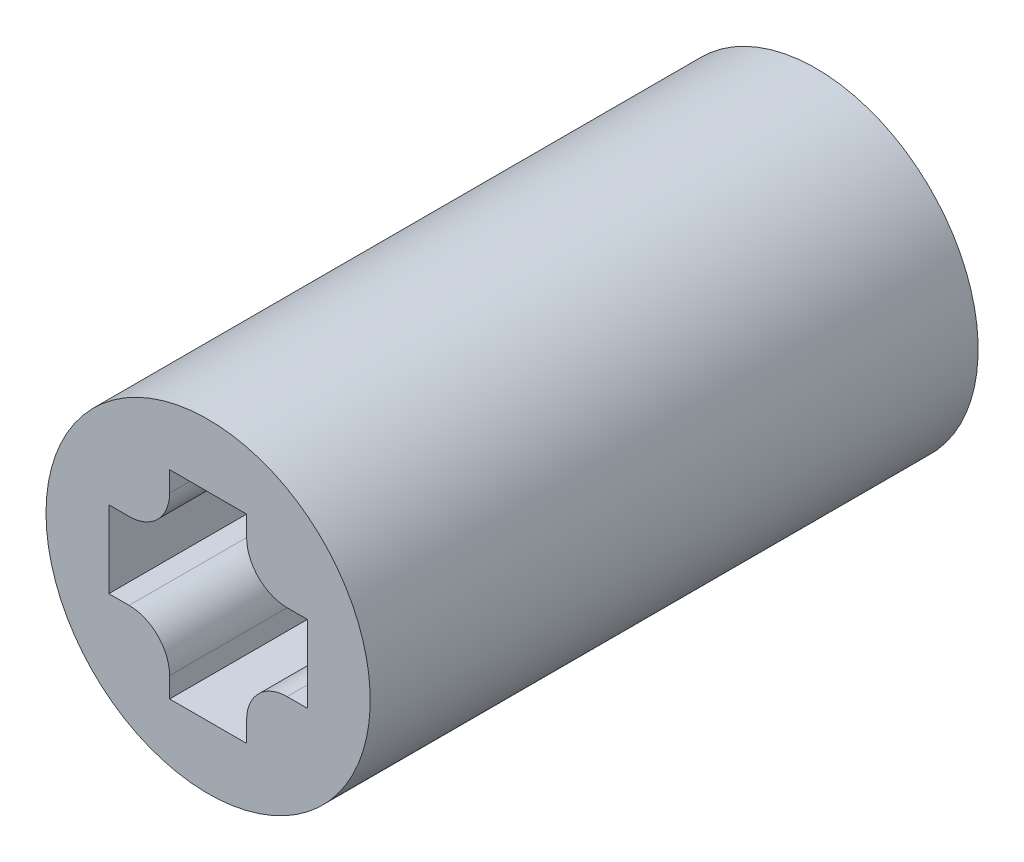
ISO-10303-21;
HEADER;
FILE_DESCRIPTION(('STEP AP214'),'2;1');
FILE_NAME('part.step','',(''),(''),'','','');
FILE_SCHEMA(('AUTOMOTIVE_DESIGN { 1 0 10303 214 1 1 1 1 }'));
ENDSEC;
DATA;
#1=APPLICATION_CONTEXT('core data for automotive mechanical design processes');
#2=APPLICATION_PROTOCOL_DEFINITION('international standard','automotive_design',2000,#1);
#3=PRODUCT_CONTEXT('',#1,'mechanical');
#4=PRODUCT('Part','Part','',(#3));
#5=PRODUCT_RELATED_PRODUCT_CATEGORY('part','',(#4));
#6=PRODUCT_DEFINITION_FORMATION('','',#4);
#7=PRODUCT_DEFINITION_CONTEXT('part definition',#1,'design');
#8=PRODUCT_DEFINITION('design','',#6,#7);
#9=PRODUCT_DEFINITION_SHAPE('','',#8);
#10=(LENGTH_UNIT() NAMED_UNIT(*) SI_UNIT(.MILLI.,.METRE.));
#11=(NAMED_UNIT(*) PLANE_ANGLE_UNIT() SI_UNIT($,.RADIAN.));
#12=(NAMED_UNIT(*) SI_UNIT($,.STERADIAN.) SOLID_ANGLE_UNIT());
#13=UNCERTAINTY_MEASURE_WITH_UNIT(LENGTH_MEASURE(1.E-05),#10,'distance_accuracy_value','');
#14=(GEOMETRIC_REPRESENTATION_CONTEXT(3) GLOBAL_UNCERTAINTY_ASSIGNED_CONTEXT((#13)) GLOBAL_UNIT_ASSIGNED_CONTEXT((#10,
#11,#12)) REPRESENTATION_CONTEXT('',''));
#15=CARTESIAN_POINT('',(0.,0.,0.));
#16=DIRECTION('',(0.,0.,1.));
#17=DIRECTION('',(1.,0.,0.));
#18=AXIS2_PLACEMENT_3D('',#15,#16,#17);
#19=CARTESIAN_POINT('',(0.,0.,0.));
#20=DIRECTION('',(0.,0.,1.));
#21=DIRECTION('',(1.,0.,0.));
#22=AXIS2_PLACEMENT_3D('',#19,#20,#21);
#23=PLANE('',#22);
#24=DIRECTION('',(1.,0.,0.));
#25=VECTOR('',#24,1.);
#26=CARTESIAN_POINT('',(2.,3.,0.));
#27=LINE('',#26,#25);
#28=CARTESIAN_POINT('',(-1.1,3.,0.));
#29=VERTEX_POINT('',#28);
#30=CARTESIAN_POINT('',(1.1,3.,0.));
#31=VERTEX_POINT('',#30);
#32=EDGE_CURVE('E316',#29,#31,#27,.T.);
#33=ORIENTED_EDGE('',*,*,#32,.F.);
#34=CARTESIAN_POINT('',(-1.1,2.1,0.));
#35=DIRECTION('',(0.,0.,1.));
#36=DIRECTION('',(1.,0.,0.));
#37=AXIS2_PLACEMENT_3D('',#34,#35,#36);
#38=CIRCLE('',#37,0.9);
#39=CARTESIAN_POINT('',(-2.,2.1,0.));
#40=VERTEX_POINT('',#39);
#41=EDGE_CURVE('E12',#29,#40,#38,.T.);
#42=ORIENTED_EDGE('',*,*,#41,.T.);
#43=DIRECTION('',(0.,1.,0.));
#44=VECTOR('',#43,1.);
#45=CARTESIAN_POINT('',(-2.,3.,0.));
#46=LINE('',#45,#44);
#47=CARTESIAN_POINT('',(-2.,-2.1,0.));
#48=VERTEX_POINT('',#47);
#49=EDGE_CURVE('E285',#48,#40,#46,.T.);
#50=ORIENTED_EDGE('',*,*,#49,.F.);
#51=CARTESIAN_POINT('',(-1.1,-2.1,0.));
#52=DIRECTION('',(0.,0.,1.));
#53=DIRECTION('',(1.,0.,0.));
#54=AXIS2_PLACEMENT_3D('',#51,#52,#53);
#55=CIRCLE('',#54,0.9);
#56=CARTESIAN_POINT('',(-1.1,-3.,0.));
#57=VERTEX_POINT('',#56);
#58=EDGE_CURVE('E385',#48,#57,#55,.T.);
#59=ORIENTED_EDGE('',*,*,#58,.T.);
#60=DIRECTION('',(-1.,0.,0.));
#61=VECTOR('',#60,1.);
#62=CARTESIAN_POINT('',(2.,-3.,0.));
#63=LINE('',#62,#61);
#64=CARTESIAN_POINT('',(1.1,-3.,0.));
#65=VERTEX_POINT('',#64);
#66=EDGE_CURVE('E304',#65,#57,#63,.T.);
#67=ORIENTED_EDGE('',*,*,#66,.F.);
#68=CARTESIAN_POINT('',(1.1,-2.1,0.));
#69=DIRECTION('',(0.,0.,1.));
#70=DIRECTION('',(1.,0.,0.));
#71=AXIS2_PLACEMENT_3D('',#68,#69,#70);
#72=CIRCLE('',#71,0.9);
#73=CARTESIAN_POINT('',(2.,-2.1,0.));
#74=VERTEX_POINT('',#73);
#75=EDGE_CURVE('E383',#65,#74,#72,.T.);
#76=ORIENTED_EDGE('',*,*,#75,.T.);
#77=DIRECTION('',(0.,-1.,0.));
#78=VECTOR('',#77,1.);
#79=CARTESIAN_POINT('',(2.,3.,0.));
#80=LINE('',#79,#78);
#81=CARTESIAN_POINT('',(2.,2.1,0.));
#82=VERTEX_POINT('',#81);
#83=EDGE_CURVE('E318',#82,#74,#80,.T.);
#84=ORIENTED_EDGE('',*,*,#83,.F.);
#85=CARTESIAN_POINT('',(1.1,2.1,0.));
#86=DIRECTION('',(0.,0.,1.));
#87=DIRECTION('',(1.,0.,0.));
#88=AXIS2_PLACEMENT_3D('',#85,#86,#87);
#89=CIRCLE('',#88,0.9);
#90=EDGE_CURVE('E47',#82,#31,#89,.T.);
#91=ORIENTED_EDGE('',*,*,#90,.T.);
#92=EDGE_LOOP('',(#33,#42,#50,#59,#67,#76,#84,#91));
#93=FACE_BOUND('',#92,.T.);
#94=CARTESIAN_POINT('',(0.,0.,0.));
#95=DIRECTION('',(0.,0.,-1.));
#96=DIRECTION('',(-1.,0.,0.));
#97=AXIS2_PLACEMENT_3D('',#94,#95,#96);
#98=CIRCLE('',#97,4.);
#99=CARTESIAN_POINT('',(-4.,0.,0.));
#100=VERTEX_POINT('',#99);
#101=EDGE_CURVE('E730',#100,#100,#98,.T.);
#102=ORIENTED_EDGE('',*,*,#101,.T.);
#103=EDGE_LOOP('',(#102));
#104=FACE_BOUND('',#103,.T.);
#105=ADVANCED_FACE('F39',(#93,#104),#23,.F.);
#106=CARTESIAN_POINT('',(0.,0.,15.));
#107=DIRECTION('',(0.,0.,-1.));
#108=DIRECTION('',(-1.,0.,0.));
#109=AXIS2_PLACEMENT_3D('',#106,#107,#108);
#110=CYLINDRICAL_SURFACE('',#109,4.);
#111=ORIENTED_EDGE('',*,*,#101,.F.);
#112=EDGE_LOOP('',(#111));
#113=FACE_BOUND('',#112,.T.);
#114=CARTESIAN_POINT('',(0.,0.,15.));
#115=DIRECTION('',(0.,0.,-1.));
#116=DIRECTION('',(-1.,0.,0.));
#117=AXIS2_PLACEMENT_3D('',#114,#115,#116);
#118=CIRCLE('',#117,4.);
#119=CARTESIAN_POINT('',(-4.,0.,15.));
#120=VERTEX_POINT('',#119);
#121=EDGE_CURVE('E255',#120,#120,#118,.T.);
#122=ORIENTED_EDGE('',*,*,#121,.T.);
#123=EDGE_LOOP('',(#122));
#124=FACE_BOUND('',#123,.T.);
#125=ADVANCED_FACE('F430',(#113,#124),#110,.T.);
#126=CARTESIAN_POINT('',(0.,0.,15.));
#127=DIRECTION('',(0.,0.,1.));
#128=DIRECTION('',(1.,0.,0.));
#129=AXIS2_PLACEMENT_3D('',#126,#127,#128);
#130=PLANE('',#129);
#131=ORIENTED_EDGE('',*,*,#121,.F.);
#132=EDGE_LOOP('',(#131));
#133=FACE_BOUND('',#132,.T.);
#134=DIRECTION('',(0.,-1.,0.));
#135=VECTOR('',#134,1.);
#136=CARTESIAN_POINT('',(-0.949999999999999,-0.95,15.));
#137=LINE('',#136,#135);
#138=CARTESIAN_POINT('',(-0.949999999999999,-1.95,15.));
#139=VERTEX_POINT('',#138);
#140=CARTESIAN_POINT('',(-0.949999999999999,-2.45,15.));
#141=VERTEX_POINT('',#140);
#142=EDGE_CURVE('E276',#139,#141,#137,.T.);
#143=ORIENTED_EDGE('',*,*,#142,.F.);
#144=CARTESIAN_POINT('',(-1.95,-1.95,15.));
#145=DIRECTION('',(0.,0.,1.));
#146=DIRECTION('',(1.,0.,0.));
#147=AXIS2_PLACEMENT_3D('',#144,#145,#146);
#148=CIRCLE('',#147,1.);
#149=CARTESIAN_POINT('',(-1.95,-0.95,15.));
#150=VERTEX_POINT('',#149);
#151=EDGE_CURVE('E331',#139,#150,#148,.T.);
#152=ORIENTED_EDGE('',*,*,#151,.T.);
#153=DIRECTION('',(1.,0.,0.));
#154=VECTOR('',#153,1.);
#155=CARTESIAN_POINT('',(-2.45,-0.95,15.));
#156=LINE('',#155,#154);
#157=CARTESIAN_POINT('',(-2.45,-0.95,15.));
#158=VERTEX_POINT('',#157);
#159=EDGE_CURVE('E273',#158,#150,#156,.T.);
#160=ORIENTED_EDGE('',*,*,#159,.F.);
#161=DIRECTION('',(0.,-1.,0.));
#162=VECTOR('',#161,1.);
#163=CARTESIAN_POINT('',(-2.45,0.95,15.));
#164=LINE('',#163,#162);
#165=CARTESIAN_POINT('',(-2.45,0.95,15.));
#166=VERTEX_POINT('',#165);
#167=EDGE_CURVE('E270',#166,#158,#164,.T.);
#168=ORIENTED_EDGE('',*,*,#167,.F.);
#169=DIRECTION('',(-1.,0.,0.));
#170=VECTOR('',#169,1.);
#171=CARTESIAN_POINT('',(-2.45,0.95,15.));
#172=LINE('',#171,#170);
#173=CARTESIAN_POINT('',(-1.95,0.95,15.));
#174=VERTEX_POINT('',#173);
#175=EDGE_CURVE('E268',#174,#166,#172,.T.);
#176=ORIENTED_EDGE('',*,*,#175,.F.);
#177=CARTESIAN_POINT('',(-1.95,1.95,15.));
#178=DIRECTION('',(0.,0.,1.));
#179=DIRECTION('',(1.,0.,0.));
#180=AXIS2_PLACEMENT_3D('',#177,#178,#179);
#181=CIRCLE('',#180,1.);
#182=CARTESIAN_POINT('',(-0.949999999999999,1.95,15.));
#183=VERTEX_POINT('',#182);
#184=EDGE_CURVE('E327',#174,#183,#181,.T.);
#185=ORIENTED_EDGE('',*,*,#184,.T.);
#186=DIRECTION('',(0.,-1.,0.));
#187=VECTOR('',#186,1.);
#188=CARTESIAN_POINT('',(-0.949999999999999,2.45,15.));
#189=LINE('',#188,#187);
#190=CARTESIAN_POINT('',(-0.949999999999999,2.45,15.));
#191=VERTEX_POINT('',#190);
#192=EDGE_CURVE('E265',#191,#183,#189,.T.);
#193=ORIENTED_EDGE('',*,*,#192,.F.);
#194=DIRECTION('',(-1.,0.,0.));
#195=VECTOR('',#194,1.);
#196=CARTESIAN_POINT('',(-0.949999999999999,2.45,15.));
#197=LINE('',#196,#195);
#198=CARTESIAN_POINT('',(0.950000000000001,2.45,15.));
#199=VERTEX_POINT('',#198);
#200=EDGE_CURVE('E262',#199,#191,#197,.T.);
#201=ORIENTED_EDGE('',*,*,#200,.F.);
#202=DIRECTION('',(0.,1.,0.));
#203=VECTOR('',#202,1.);
#204=CARTESIAN_POINT('',(0.950000000000001,2.45,15.));
#205=LINE('',#204,#203);
#206=CARTESIAN_POINT('',(0.950000000000001,1.95,15.));
#207=VERTEX_POINT('',#206);
#208=EDGE_CURVE('E260',#207,#199,#205,.T.);
#209=ORIENTED_EDGE('',*,*,#208,.F.);
#210=CARTESIAN_POINT('',(1.95,1.95,15.));
#211=DIRECTION('',(0.,0.,1.));
#212=DIRECTION('',(1.,0.,0.));
#213=AXIS2_PLACEMENT_3D('',#210,#211,#212);
#214=CIRCLE('',#213,1.);
#215=CARTESIAN_POINT('',(1.95,0.95,15.));
#216=VERTEX_POINT('',#215);
#217=EDGE_CURVE('E325',#207,#216,#214,.T.);
#218=ORIENTED_EDGE('',*,*,#217,.T.);
#219=DIRECTION('',(-1.,0.,0.));
#220=VECTOR('',#219,1.);
#221=CARTESIAN_POINT('',(0.950000000000001,0.95,15.));
#222=LINE('',#221,#220);
#223=CARTESIAN_POINT('',(2.45,0.95,15.));
#224=VERTEX_POINT('',#223);
#225=EDGE_CURVE('E257',#224,#216,#222,.T.);
#226=ORIENTED_EDGE('',*,*,#225,.F.);
#227=DIRECTION('',(0.,1.,0.));
#228=VECTOR('',#227,1.);
#229=CARTESIAN_POINT('',(2.45,0.95,15.));
#230=LINE('',#229,#228);
#231=CARTESIAN_POINT('',(2.45,-0.95,15.));
#232=VERTEX_POINT('',#231);
#233=EDGE_CURVE('E254',#232,#224,#230,.T.);
#234=ORIENTED_EDGE('',*,*,#233,.F.);
#235=DIRECTION('',(1.,0.,0.));
#236=VECTOR('',#235,1.);
#237=CARTESIAN_POINT('',(0.950000000000001,-0.95,15.));
#238=LINE('',#237,#236);
#239=CARTESIAN_POINT('',(1.95,-0.95,15.));
#240=VERTEX_POINT('',#239);
#241=EDGE_CURVE('E217',#240,#232,#238,.T.);
#242=ORIENTED_EDGE('',*,*,#241,.F.);
#243=CARTESIAN_POINT('',(1.95,-1.95,15.));
#244=DIRECTION('',(0.,0.,1.));
#245=DIRECTION('',(1.,0.,0.));
#246=AXIS2_PLACEMENT_3D('',#243,#244,#245);
#247=CIRCLE('',#246,1.);
#248=CARTESIAN_POINT('',(0.950000000000001,-1.95,15.));
#249=VERTEX_POINT('',#248);
#250=EDGE_CURVE('E329',#240,#249,#247,.T.);
#251=ORIENTED_EDGE('',*,*,#250,.T.);
#252=DIRECTION('',(0.,1.,0.));
#253=VECTOR('',#252,1.);
#254=CARTESIAN_POINT('',(0.950000000000001,-0.95,15.));
#255=LINE('',#254,#253);
#256=CARTESIAN_POINT('',(0.950000000000002,-2.45,15.));
#257=VERTEX_POINT('',#256);
#258=EDGE_CURVE('E211',#257,#249,#255,.T.);
#259=ORIENTED_EDGE('',*,*,#258,.F.);
#260=DIRECTION('',(1.,0.,0.));
#261=VECTOR('',#260,1.);
#262=CARTESIAN_POINT('',(-0.949999999999999,-2.45,15.));
#263=LINE('',#262,#261);
#264=EDGE_CURVE('E278',#141,#257,#263,.T.);
#265=ORIENTED_EDGE('',*,*,#264,.F.);
#266=EDGE_LOOP('',(#143,#152,#160,#168,#176,#185,#193,#201,#209,#218,#226,#234,#242,#251,#259,#265));
#267=FACE_BOUND('',#266,.T.);
#268=ADVANCED_FACE('F435',(#133,#267),#130,.T.);
#269=CARTESIAN_POINT('',(0.950000000000001,-0.95,8.00000000000001));
#270=DIRECTION('',(0.,-1.,0.));
#271=DIRECTION('',(0.,0.,-1.));
#272=AXIS2_PLACEMENT_3D('',#269,#270,#271);
#273=PLANE('',#272);
#274=DIRECTION('',(1.,0.,0.));
#275=VECTOR('',#274,1.);
#276=CARTESIAN_POINT('',(0.950000000000001,-0.95,8.00000000000001));
#277=LINE('',#276,#275);
#278=CARTESIAN_POINT('',(1.95,-0.95,8.00000000000001));
#279=VERTEX_POINT('',#278);
#280=CARTESIAN_POINT('',(2.45,-0.95,8.00000000000001));
#281=VERTEX_POINT('',#280);
#282=EDGE_CURVE('E199',#279,#281,#277,.T.);
#283=ORIENTED_EDGE('',*,*,#282,.F.);
#284=DIRECTION('',(0.,0.,1.));
#285=VECTOR('',#284,1.);
#286=CARTESIAN_POINT('',(1.95,-0.95,8.00000000000001));
#287=LINE('',#286,#285);
#288=EDGE_CURVE('E335',#279,#240,#287,.T.);
#289=ORIENTED_EDGE('',*,*,#288,.T.);
#290=ORIENTED_EDGE('',*,*,#241,.T.);
#291=DIRECTION('',(0.,0.,1.));
#292=VECTOR('',#291,1.);
#293=CARTESIAN_POINT('',(2.45,-0.95,8.00000000000001));
#294=LINE('',#293,#292);
#295=EDGE_CURVE('E214',#281,#232,#294,.T.);
#296=ORIENTED_EDGE('',*,*,#295,.F.);
#297=EDGE_LOOP('',(#283,#289,#290,#296));
#298=FACE_BOUND('',#297,.T.);
#299=ADVANCED_FACE('F215',(#298),#273,.F.);
#300=CARTESIAN_POINT('',(0.950000000000001,-0.95,8.00000000000001));
#301=DIRECTION('',(1.,0.,0.));
#302=DIRECTION('',(0.,1.,0.));
#303=AXIS2_PLACEMENT_3D('',#300,#301,#302);
#304=PLANE('',#303);
#305=ORIENTED_EDGE('',*,*,#258,.T.);
#306=DIRECTION('',(0.,0.,1.));
#307=VECTOR('',#306,1.);
#308=CARTESIAN_POINT('',(0.950000000000001,-1.95,8.00000000000001));
#309=LINE('',#308,#307);
#310=CARTESIAN_POINT('',(0.950000000000001,-1.95,8.00000000000001));
#311=VERTEX_POINT('',#310);
#312=EDGE_CURVE('E337',#249,#311,#309,.F.);
#313=ORIENTED_EDGE('',*,*,#312,.T.);
#314=DIRECTION('',(0.,1.,0.));
#315=VECTOR('',#314,1.);
#316=CARTESIAN_POINT('',(0.950000000000001,-0.95,8.00000000000001));
#317=LINE('',#316,#315);
#318=CARTESIAN_POINT('',(0.950000000000002,-2.45,8.00000000000001));
#319=VERTEX_POINT('',#318);
#320=EDGE_CURVE('E222',#319,#311,#317,.T.);
#321=ORIENTED_EDGE('',*,*,#320,.F.);
#322=DIRECTION('',(0.,0.,1.));
#323=VECTOR('',#322,1.);
#324=CARTESIAN_POINT('',(0.950000000000002,-2.45,8.00000000000001));
#325=LINE('',#324,#323);
#326=EDGE_CURVE('E283',#319,#257,#325,.T.);
#327=ORIENTED_EDGE('',*,*,#326,.T.);
#328=EDGE_LOOP('',(#305,#313,#321,#327));
#329=FACE_BOUND('',#328,.T.);
#330=ADVANCED_FACE('F505',(#329),#304,.F.);
#331=CARTESIAN_POINT('',(-0.949999999999999,-2.45,8.00000000000001));
#332=DIRECTION('',(0.,-1.,0.));
#333=DIRECTION('',(0.,0.,-1.));
#334=AXIS2_PLACEMENT_3D('',#331,#332,#333);
#335=PLANE('',#334);
#336=ORIENTED_EDGE('',*,*,#264,.T.);
#337=ORIENTED_EDGE('',*,*,#326,.F.);
#338=DIRECTION('',(1.,0.,0.));
#339=VECTOR('',#338,1.);
#340=CARTESIAN_POINT('',(-0.949999999999999,-2.45,8.00000000000001));
#341=LINE('',#340,#339);
#342=CARTESIAN_POINT('',(-0.949999999999999,-2.45,8.00000000000001));
#343=VERTEX_POINT('',#342);
#344=EDGE_CURVE('E249',#343,#319,#341,.T.);
#345=ORIENTED_EDGE('',*,*,#344,.F.);
#346=DIRECTION('',(0.,0.,1.));
#347=VECTOR('',#346,1.);
#348=CARTESIAN_POINT('',(-0.949999999999999,-2.45,8.00000000000001));
#349=LINE('',#348,#347);
#350=EDGE_CURVE('E286',#343,#141,#349,.T.);
#351=ORIENTED_EDGE('',*,*,#350,.T.);
#352=EDGE_LOOP('',(#336,#337,#345,#351));
#353=FACE_BOUND('',#352,.T.);
#354=ADVANCED_FACE('F501',(#353),#335,.F.);
#355=CARTESIAN_POINT('',(-0.949999999999999,-0.95,8.00000000000001));
#356=DIRECTION('',(-1.,0.,0.));
#357=DIRECTION('',(0.,-1.,0.));
#358=AXIS2_PLACEMENT_3D('',#355,#356,#357);
#359=PLANE('',#358);
#360=DIRECTION('',(0.,-1.,0.));
#361=VECTOR('',#360,1.);
#362=CARTESIAN_POINT('',(-0.949999999999999,-0.95,8.00000000000001));
#363=LINE('',#362,#361);
#364=CARTESIAN_POINT('',(-0.949999999999999,-1.95,8.00000000000001));
#365=VERTEX_POINT('',#364);
#366=EDGE_CURVE('E247',#365,#343,#363,.T.);
#367=ORIENTED_EDGE('',*,*,#366,.F.);
#368=DIRECTION('',(0.,0.,1.));
#369=VECTOR('',#368,1.);
#370=CARTESIAN_POINT('',(-0.949999999999999,-1.95,8.00000000000001));
#371=LINE('',#370,#369);
#372=EDGE_CURVE('E313',#365,#139,#371,.T.);
#373=ORIENTED_EDGE('',*,*,#372,.T.);
#374=ORIENTED_EDGE('',*,*,#142,.T.);
#375=ORIENTED_EDGE('',*,*,#350,.F.);
#376=EDGE_LOOP('',(#367,#373,#374,#375));
#377=FACE_BOUND('',#376,.T.);
#378=ADVANCED_FACE('F496',(#377),#359,.F.);
#379=CARTESIAN_POINT('',(-2.45,-0.95,8.00000000000001));
#380=DIRECTION('',(0.,-1.,0.));
#381=DIRECTION('',(0.,0.,-1.));
#382=AXIS2_PLACEMENT_3D('',#379,#380,#381);
#383=PLANE('',#382);
#384=ORIENTED_EDGE('',*,*,#159,.T.);
#385=DIRECTION('',(0.,0.,1.));
#386=VECTOR('',#385,1.);
#387=CARTESIAN_POINT('',(-1.95,-0.95,8.00000000000001));
#388=LINE('',#387,#386);
#389=CARTESIAN_POINT('',(-1.95,-0.95,8.00000000000001));
#390=VERTEX_POINT('',#389);
#391=EDGE_CURVE('E333',#150,#390,#388,.F.);
#392=ORIENTED_EDGE('',*,*,#391,.T.);
#393=DIRECTION('',(1.,0.,0.));
#394=VECTOR('',#393,1.);
#395=CARTESIAN_POINT('',(-2.45,-0.95,8.00000000000001));
#396=LINE('',#395,#394);
#397=CARTESIAN_POINT('',(-2.45,-0.95,8.00000000000001));
#398=VERTEX_POINT('',#397);
#399=EDGE_CURVE('E244',#398,#390,#396,.T.);
#400=ORIENTED_EDGE('',*,*,#399,.F.);
#401=DIRECTION('',(0.,0.,1.));
#402=VECTOR('',#401,1.);
#403=CARTESIAN_POINT('',(-2.45,-0.95,8.00000000000001));
#404=LINE('',#403,#402);
#405=EDGE_CURVE('E289',#398,#158,#404,.T.);
#406=ORIENTED_EDGE('',*,*,#405,.T.);
#407=EDGE_LOOP('',(#384,#392,#400,#406));
#408=FACE_BOUND('',#407,.T.);
#409=ADVANCED_FACE('F627',(#408),#383,.F.);
#410=CARTESIAN_POINT('',(-2.45,0.95,8.00000000000001));
#411=DIRECTION('',(-1.,0.,0.));
#412=DIRECTION('',(0.,-1.,0.));
#413=AXIS2_PLACEMENT_3D('',#410,#411,#412);
#414=PLANE('',#413);
#415=ORIENTED_EDGE('',*,*,#167,.T.);
#416=ORIENTED_EDGE('',*,*,#405,.F.);
#417=DIRECTION('',(0.,-1.,0.));
#418=VECTOR('',#417,1.);
#419=CARTESIAN_POINT('',(-2.45,0.95,8.00000000000001));
#420=LINE('',#419,#418);
#421=CARTESIAN_POINT('',(-2.45,0.95,8.00000000000001));
#422=VERTEX_POINT('',#421);
#423=EDGE_CURVE('E241',#422,#398,#420,.T.);
#424=ORIENTED_EDGE('',*,*,#423,.F.);
#425=DIRECTION('',(0.,0.,1.));
#426=VECTOR('',#425,1.);
#427=CARTESIAN_POINT('',(-2.45,0.95,8.00000000000001));
#428=LINE('',#427,#426);
#429=EDGE_CURVE('E291',#422,#166,#428,.T.);
#430=ORIENTED_EDGE('',*,*,#429,.T.);
#431=EDGE_LOOP('',(#415,#416,#424,#430));
#432=FACE_BOUND('',#431,.T.);
#433=ADVANCED_FACE('F487',(#432),#414,.F.);
#434=CARTESIAN_POINT('',(-2.45,0.95,8.00000000000001));
#435=DIRECTION('',(0.,1.,0.));
#436=DIRECTION('',(-1.,0.,0.));
#437=AXIS2_PLACEMENT_3D('',#434,#435,#436);
#438=PLANE('',#437);
#439=DIRECTION('',(-1.,0.,0.));
#440=VECTOR('',#439,1.);
#441=CARTESIAN_POINT('',(-2.45,0.95,8.00000000000001));
#442=LINE('',#441,#440);
#443=CARTESIAN_POINT('',(-1.95,0.95,8.00000000000001));
#444=VERTEX_POINT('',#443);
#445=EDGE_CURVE('E239',#444,#422,#442,.T.);
#446=ORIENTED_EDGE('',*,*,#445,.F.);
#447=DIRECTION('',(0.,0.,1.));
#448=VECTOR('',#447,1.);
#449=CARTESIAN_POINT('',(-1.95,0.95,8.00000000000001));
#450=LINE('',#449,#448);
#451=EDGE_CURVE('E339',#444,#174,#450,.T.);
#452=ORIENTED_EDGE('',*,*,#451,.T.);
#453=ORIENTED_EDGE('',*,*,#175,.T.);
#454=ORIENTED_EDGE('',*,*,#429,.F.);
#455=EDGE_LOOP('',(#446,#452,#453,#454));
#456=FACE_BOUND('',#455,.T.);
#457=ADVANCED_FACE('F479',(#456),#438,.F.);
#458=CARTESIAN_POINT('',(-0.949999999999999,2.45,8.00000000000001));
#459=DIRECTION('',(-1.,0.,0.));
#460=DIRECTION('',(0.,-1.,0.));
#461=AXIS2_PLACEMENT_3D('',#458,#459,#460);
#462=PLANE('',#461);
#463=ORIENTED_EDGE('',*,*,#192,.T.);
#464=DIRECTION('',(0.,0.,1.));
#465=VECTOR('',#464,1.);
#466=CARTESIAN_POINT('',(-0.949999999999999,1.95,8.00000000000001));
#467=LINE('',#466,#465);
#468=CARTESIAN_POINT('',(-0.949999999999999,1.95,8.00000000000001));
#469=VERTEX_POINT('',#468);
#470=EDGE_CURVE('E342',#183,#469,#467,.F.);
#471=ORIENTED_EDGE('',*,*,#470,.T.);
#472=DIRECTION('',(0.,-1.,0.));
#473=VECTOR('',#472,1.);
#474=CARTESIAN_POINT('',(-0.949999999999999,2.45,8.00000000000001));
#475=LINE('',#474,#473);
#476=CARTESIAN_POINT('',(-0.949999999999999,2.45,8.00000000000001));
#477=VERTEX_POINT('',#476);
#478=EDGE_CURVE('E236',#477,#469,#475,.T.);
#479=ORIENTED_EDGE('',*,*,#478,.F.);
#480=DIRECTION('',(0.,0.,1.));
#481=VECTOR('',#480,1.);
#482=CARTESIAN_POINT('',(-0.949999999999999,2.45,8.00000000000001));
#483=LINE('',#482,#481);
#484=EDGE_CURVE('E294',#477,#191,#483,.T.);
#485=ORIENTED_EDGE('',*,*,#484,.T.);
#486=EDGE_LOOP('',(#463,#471,#479,#485));
#487=FACE_BOUND('',#486,.T.);
#488=ADVANCED_FACE('F646',(#487),#462,.F.);
#489=CARTESIAN_POINT('',(-0.949999999999999,2.45,8.00000000000001));
#490=DIRECTION('',(0.,1.,0.));
#491=DIRECTION('',(0.,0.,1.));
#492=AXIS2_PLACEMENT_3D('',#489,#490,#491);
#493=PLANE('',#492);
#494=ORIENTED_EDGE('',*,*,#200,.T.);
#495=ORIENTED_EDGE('',*,*,#484,.F.);
#496=DIRECTION('',(-1.,0.,0.));
#497=VECTOR('',#496,1.);
#498=CARTESIAN_POINT('',(-0.949999999999999,2.45,8.00000000000001));
#499=LINE('',#498,#497);
#500=CARTESIAN_POINT('',(0.950000000000001,2.45,8.00000000000001));
#501=VERTEX_POINT('',#500);
#502=EDGE_CURVE('E233',#501,#477,#499,.T.);
#503=ORIENTED_EDGE('',*,*,#502,.F.);
#504=DIRECTION('',(0.,0.,1.));
#505=VECTOR('',#504,1.);
#506=CARTESIAN_POINT('',(0.950000000000001,2.45,8.00000000000001));
#507=LINE('',#506,#505);
#508=EDGE_CURVE('E296',#501,#199,#507,.T.);
#509=ORIENTED_EDGE('',*,*,#508,.T.);
#510=EDGE_LOOP('',(#494,#495,#503,#509));
#511=FACE_BOUND('',#510,.T.);
#512=ADVANCED_FACE('F470',(#511),#493,.F.);
#513=CARTESIAN_POINT('',(0.950000000000001,2.45,8.00000000000001));
#514=DIRECTION('',(1.,0.,0.));
#515=DIRECTION('',(0.,1.,0.));
#516=AXIS2_PLACEMENT_3D('',#513,#514,#515);
#517=PLANE('',#516);
#518=DIRECTION('',(0.,1.,0.));
#519=VECTOR('',#518,1.);
#520=CARTESIAN_POINT('',(0.950000000000001,2.45,8.00000000000001));
#521=LINE('',#520,#519);
#522=CARTESIAN_POINT('',(0.950000000000001,1.95,8.00000000000001));
#523=VERTEX_POINT('',#522);
#524=EDGE_CURVE('E228',#523,#501,#521,.T.);
#525=ORIENTED_EDGE('',*,*,#524,.F.);
#526=DIRECTION('',(0.,0.,1.));
#527=VECTOR('',#526,1.);
#528=CARTESIAN_POINT('',(0.950000000000001,1.95,8.00000000000001));
#529=LINE('',#528,#527);
#530=EDGE_CURVE('E344',#523,#207,#529,.T.);
#531=ORIENTED_EDGE('',*,*,#530,.T.);
#532=ORIENTED_EDGE('',*,*,#208,.T.);
#533=ORIENTED_EDGE('',*,*,#508,.F.);
#534=EDGE_LOOP('',(#525,#531,#532,#533));
#535=FACE_BOUND('',#534,.T.);
#536=ADVANCED_FACE('F465',(#535),#517,.F.);
#537=CARTESIAN_POINT('',(0.950000000000001,0.95,8.00000000000001));
#538=DIRECTION('',(0.,1.,0.));
#539=DIRECTION('',(-1.,0.,0.));
#540=AXIS2_PLACEMENT_3D('',#537,#538,#539);
#541=PLANE('',#540);
#542=ORIENTED_EDGE('',*,*,#225,.T.);
#543=DIRECTION('',(0.,0.,1.));
#544=VECTOR('',#543,1.);
#545=CARTESIAN_POINT('',(1.95,0.95,8.00000000000001));
#546=LINE('',#545,#544);
#547=CARTESIAN_POINT('',(1.95,0.95,8.00000000000001));
#548=VERTEX_POINT('',#547);
#549=EDGE_CURVE('E347',#216,#548,#546,.F.);
#550=ORIENTED_EDGE('',*,*,#549,.T.);
#551=DIRECTION('',(-1.,0.,0.));
#552=VECTOR('',#551,1.);
#553=CARTESIAN_POINT('',(0.950000000000001,0.95,8.00000000000001));
#554=LINE('',#553,#552);
#555=CARTESIAN_POINT('',(2.45,0.95,8.00000000000001));
#556=VERTEX_POINT('',#555);
#557=EDGE_CURVE('E226',#556,#548,#554,.T.);
#558=ORIENTED_EDGE('',*,*,#557,.F.);
#559=DIRECTION('',(0.,0.,1.));
#560=VECTOR('',#559,1.);
#561=CARTESIAN_POINT('',(2.45,0.95,8.00000000000001));
#562=LINE('',#561,#560);
#563=EDGE_CURVE('E221',#556,#224,#562,.T.);
#564=ORIENTED_EDGE('',*,*,#563,.T.);
#565=EDGE_LOOP('',(#542,#550,#558,#564));
#566=FACE_BOUND('',#565,.T.);
#567=ADVANCED_FACE('F509',(#566),#541,.F.);
#568=CARTESIAN_POINT('',(2.45,0.95,8.00000000000001));
#569=DIRECTION('',(1.,0.,0.));
#570=DIRECTION('',(0.,0.,-1.));
#571=AXIS2_PLACEMENT_3D('',#568,#569,#570);
#572=PLANE('',#571);
#573=ORIENTED_EDGE('',*,*,#233,.T.);
#574=ORIENTED_EDGE('',*,*,#563,.F.);
#575=DIRECTION('',(0.,1.,0.));
#576=VECTOR('',#575,1.);
#577=CARTESIAN_POINT('',(2.45,0.95,8.00000000000001));
#578=LINE('',#577,#576);
#579=EDGE_CURVE('E205',#281,#556,#578,.T.);
#580=ORIENTED_EDGE('',*,*,#579,.F.);
#581=ORIENTED_EDGE('',*,*,#295,.T.);
#582=EDGE_LOOP('',(#573,#574,#580,#581));
#583=FACE_BOUND('',#582,.T.);
#584=ADVANCED_FACE('F224',(#583),#572,.F.);
#585=CARTESIAN_POINT('',(0.,0.,8.00000000000001));
#586=DIRECTION('',(0.,0.,-1.));
#587=DIRECTION('',(-1.,0.,0.));
#588=AXIS2_PLACEMENT_3D('',#585,#586,#587);
#589=PLANE('',#588);
#590=ORIENTED_EDGE('',*,*,#320,.T.);
#591=CARTESIAN_POINT('',(1.95,-1.95,8.00000000000001));
#592=DIRECTION('',(0.,0.,-1.));
#593=DIRECTION('',(-1.,0.,0.));
#594=AXIS2_PLACEMENT_3D('',#591,#592,#593);
#595=CIRCLE('',#594,1.);
#596=EDGE_CURVE('E207',#311,#279,#595,.T.);
#597=ORIENTED_EDGE('',*,*,#596,.T.);
#598=ORIENTED_EDGE('',*,*,#282,.T.);
#599=ORIENTED_EDGE('',*,*,#579,.T.);
#600=ORIENTED_EDGE('',*,*,#557,.T.);
#601=CARTESIAN_POINT('',(1.95,1.95,8.00000000000001));
#602=DIRECTION('',(0.,0.,-1.));
#603=DIRECTION('',(-1.,0.,0.));
#604=AXIS2_PLACEMENT_3D('',#601,#602,#603);
#605=CIRCLE('',#604,1.);
#606=EDGE_CURVE('E354',#548,#523,#605,.T.);
#607=ORIENTED_EDGE('',*,*,#606,.T.);
#608=ORIENTED_EDGE('',*,*,#524,.T.);
#609=ORIENTED_EDGE('',*,*,#502,.T.);
#610=ORIENTED_EDGE('',*,*,#478,.T.);
#611=CARTESIAN_POINT('',(-1.95,1.95,8.00000000000001));
#612=DIRECTION('',(0.,0.,-1.));
#613=DIRECTION('',(-1.,0.,0.));
#614=AXIS2_PLACEMENT_3D('',#611,#612,#613);
#615=CIRCLE('',#614,1.);
#616=EDGE_CURVE('E352',#469,#444,#615,.T.);
#617=ORIENTED_EDGE('',*,*,#616,.T.);
#618=ORIENTED_EDGE('',*,*,#445,.T.);
#619=ORIENTED_EDGE('',*,*,#423,.T.);
#620=ORIENTED_EDGE('',*,*,#399,.T.);
#621=CARTESIAN_POINT('',(-1.95,-1.95,8.00000000000001));
#622=DIRECTION('',(0.,0.,-1.));
#623=DIRECTION('',(-1.,0.,0.));
#624=AXIS2_PLACEMENT_3D('',#621,#622,#623);
#625=CIRCLE('',#624,1.);
#626=EDGE_CURVE('E349',#390,#365,#625,.T.);
#627=ORIENTED_EDGE('',*,*,#626,.T.);
#628=ORIENTED_EDGE('',*,*,#366,.T.);
#629=ORIENTED_EDGE('',*,*,#344,.T.);
#630=EDGE_LOOP('',(#590,#597,#598,#599,#600,#607,#608,#609,#610,#617,#618,#619,#620,#627,#628,#629));
#631=FACE_BOUND('',#630,.T.);
#632=ADVANCED_FACE('F202',(#631),#589,.F.);
#633=CARTESIAN_POINT('',(-1.95,-1.95,8.00000000000001));
#634=DIRECTION('',(0.,0.,1.));
#635=DIRECTION('',(1.,0.,0.));
#636=AXIS2_PLACEMENT_3D('',#633,#634,#635);
#637=CYLINDRICAL_SURFACE('',#636,1.);
#638=ORIENTED_EDGE('',*,*,#626,.F.);
#639=ORIENTED_EDGE('',*,*,#391,.F.);
#640=ORIENTED_EDGE('',*,*,#151,.F.);
#641=ORIENTED_EDGE('',*,*,#372,.F.);
#642=EDGE_LOOP('',(#638,#639,#640,#641));
#643=FACE_BOUND('',#642,.T.);
#644=ADVANCED_FACE('F441',(#643),#637,.T.);
#645=CARTESIAN_POINT('',(1.95,-1.95,8.00000000000001));
#646=DIRECTION('',(0.,0.,1.));
#647=DIRECTION('',(1.,0.,0.));
#648=AXIS2_PLACEMENT_3D('',#645,#646,#647);
#649=CYLINDRICAL_SURFACE('',#648,1.);
#650=ORIENTED_EDGE('',*,*,#596,.F.);
#651=ORIENTED_EDGE('',*,*,#312,.F.);
#652=ORIENTED_EDGE('',*,*,#250,.F.);
#653=ORIENTED_EDGE('',*,*,#288,.F.);
#654=EDGE_LOOP('',(#650,#651,#652,#653));
#655=FACE_BOUND('',#654,.T.);
#656=ADVANCED_FACE('F444',(#655),#649,.T.);
#657=CARTESIAN_POINT('',(-1.95,1.95,8.00000000000001));
#658=DIRECTION('',(0.,0.,1.));
#659=DIRECTION('',(1.,0.,0.));
#660=AXIS2_PLACEMENT_3D('',#657,#658,#659);
#661=CYLINDRICAL_SURFACE('',#660,1.);
#662=ORIENTED_EDGE('',*,*,#616,.F.);
#663=ORIENTED_EDGE('',*,*,#470,.F.);
#664=ORIENTED_EDGE('',*,*,#184,.F.);
#665=ORIENTED_EDGE('',*,*,#451,.F.);
#666=EDGE_LOOP('',(#662,#663,#664,#665));
#667=FACE_BOUND('',#666,.T.);
#668=ADVANCED_FACE('F448',(#667),#661,.T.);
#669=CARTESIAN_POINT('',(1.95,1.95,8.00000000000001));
#670=DIRECTION('',(0.,0.,1.));
#671=DIRECTION('',(1.,0.,0.));
#672=AXIS2_PLACEMENT_3D('',#669,#670,#671);
#673=CYLINDRICAL_SURFACE('',#672,1.);
#674=ORIENTED_EDGE('',*,*,#606,.F.);
#675=ORIENTED_EDGE('',*,*,#549,.F.);
#676=ORIENTED_EDGE('',*,*,#217,.F.);
#677=ORIENTED_EDGE('',*,*,#530,.F.);
#678=EDGE_LOOP('',(#674,#675,#676,#677));
#679=FACE_BOUND('',#678,.T.);
#680=ADVANCED_FACE('F451',(#679),#673,.T.);
#681=CARTESIAN_POINT('',(0.,0.,7.));
#682=DIRECTION('',(0.,0.,-1.));
#683=DIRECTION('',(-1.,0.,0.));
#684=AXIS2_PLACEMENT_3D('',#681,#682,#683);
#685=PLANE('',#684);
#686=DIRECTION('',(0.,-1.,0.));
#687=VECTOR('',#686,1.);
#688=CARTESIAN_POINT('',(2.,3.,7.));
#689=LINE('',#688,#687);
#690=CARTESIAN_POINT('',(2.,2.1,7.));
#691=VERTEX_POINT('',#690);
#692=CARTESIAN_POINT('',(2.,-2.1,7.));
#693=VERTEX_POINT('',#692);
#694=EDGE_CURVE('E307',#691,#693,#689,.T.);
#695=ORIENTED_EDGE('',*,*,#694,.T.);
#696=CARTESIAN_POINT('',(1.1,-2.1,7.));
#697=DIRECTION('',(0.,0.,-1.));
#698=DIRECTION('',(-1.,0.,0.));
#699=AXIS2_PLACEMENT_3D('',#696,#697,#698);
#700=CIRCLE('',#699,0.9);
#701=CARTESIAN_POINT('',(1.1,-3.,7.));
#702=VERTEX_POINT('',#701);
#703=EDGE_CURVE('E372',#693,#702,#700,.T.);
#704=ORIENTED_EDGE('',*,*,#703,.T.);
#705=DIRECTION('',(-1.,0.,0.));
#706=VECTOR('',#705,1.);
#707=CARTESIAN_POINT('',(2.,-3.,7.));
#708=LINE('',#707,#706);
#709=CARTESIAN_POINT('',(-1.1,-3.,7.));
#710=VERTEX_POINT('',#709);
#711=EDGE_CURVE('E310',#702,#710,#708,.T.);
#712=ORIENTED_EDGE('',*,*,#711,.T.);
#713=CARTESIAN_POINT('',(-1.1,-2.1,7.));
#714=DIRECTION('',(0.,0.,-1.));
#715=DIRECTION('',(-1.,0.,0.));
#716=AXIS2_PLACEMENT_3D('',#713,#714,#715);
#717=CIRCLE('',#716,0.9);
#718=CARTESIAN_POINT('',(-2.,-2.1,7.));
#719=VERTEX_POINT('',#718);
#720=EDGE_CURVE('E370',#710,#719,#717,.T.);
#721=ORIENTED_EDGE('',*,*,#720,.T.);
#722=DIRECTION('',(0.,1.,0.));
#723=VECTOR('',#722,1.);
#724=CARTESIAN_POINT('',(-2.,3.,7.));
#725=LINE('',#724,#723);
#726=CARTESIAN_POINT('',(-2.,2.1,7.));
#727=VERTEX_POINT('',#726);
#728=EDGE_CURVE('E300',#719,#727,#725,.T.);
#729=ORIENTED_EDGE('',*,*,#728,.T.);
#730=CARTESIAN_POINT('',(-1.1,2.1,7.));
#731=DIRECTION('',(0.,0.,-1.));
#732=DIRECTION('',(-1.,0.,0.));
#733=AXIS2_PLACEMENT_3D('',#730,#731,#732);
#734=CIRCLE('',#733,0.9);
#735=CARTESIAN_POINT('',(-1.1,3.,7.));
#736=VERTEX_POINT('',#735);
#737=EDGE_CURVE('E366',#727,#736,#734,.T.);
#738=ORIENTED_EDGE('',*,*,#737,.T.);
#739=DIRECTION('',(1.,0.,0.));
#740=VECTOR('',#739,1.);
#741=CARTESIAN_POINT('',(2.,3.,7.));
#742=LINE('',#741,#740);
#743=CARTESIAN_POINT('',(1.1,3.,7.));
#744=VERTEX_POINT('',#743);
#745=EDGE_CURVE('E303',#736,#744,#742,.T.);
#746=ORIENTED_EDGE('',*,*,#745,.T.);
#747=CARTESIAN_POINT('',(1.1,2.1,7.));
#748=DIRECTION('',(0.,0.,-1.));
#749=DIRECTION('',(-1.,0.,0.));
#750=AXIS2_PLACEMENT_3D('',#747,#748,#749);
#751=CIRCLE('',#750,0.9);
#752=EDGE_CURVE('E368',#744,#691,#751,.T.);
#753=ORIENTED_EDGE('',*,*,#752,.T.);
#754=EDGE_LOOP('',(#695,#704,#712,#721,#729,#738,#746,#753));
#755=FACE_BOUND('',#754,.T.);
#756=ADVANCED_FACE('F400',(#755),#685,.T.);
#757=CARTESIAN_POINT('',(1.1,2.1,7.));
#758=DIRECTION('',(0.,0.,1.));
#759=DIRECTION('',(1.,0.,0.));
#760=AXIS2_PLACEMENT_3D('',#757,#758,#759);
#761=CYLINDRICAL_SURFACE('',#760,0.9);
#762=ORIENTED_EDGE('',*,*,#752,.F.);
#763=DIRECTION('',(0.,0.,-1.));
#764=VECTOR('',#763,1.);
#765=CARTESIAN_POINT('',(1.1,3.,7.));
#766=LINE('',#765,#764);
#767=EDGE_CURVE('E381',#31,#744,#766,.F.);
#768=ORIENTED_EDGE('',*,*,#767,.F.);
#769=ORIENTED_EDGE('',*,*,#90,.F.);
#770=DIRECTION('',(0.,0.,-1.));
#771=VECTOR('',#770,1.);
#772=CARTESIAN_POINT('',(2.,2.1,0.));
#773=LINE('',#772,#771);
#774=EDGE_CURVE('E361',#691,#82,#773,.T.);
#775=ORIENTED_EDGE('',*,*,#774,.F.);
#776=EDGE_LOOP('',(#762,#768,#769,#775));
#777=FACE_BOUND('',#776,.T.);
#778=ADVANCED_FACE('F410',(#777),#761,.F.);
#779=CARTESIAN_POINT('',(2.,3.,7.));
#780=DIRECTION('',(1.,0.,0.));
#781=DIRECTION('',(0.,1.,0.));
#782=AXIS2_PLACEMENT_3D('',#779,#780,#781);
#783=PLANE('',#782);
#784=ORIENTED_EDGE('',*,*,#83,.T.);
#785=DIRECTION('',(0.,0.,-1.));
#786=VECTOR('',#785,1.);
#787=CARTESIAN_POINT('',(2.,-2.1,7.));
#788=LINE('',#787,#786);
#789=EDGE_CURVE('E364',#74,#693,#788,.F.);
#790=ORIENTED_EDGE('',*,*,#789,.T.);
#791=ORIENTED_EDGE('',*,*,#694,.F.);
#792=ORIENTED_EDGE('',*,*,#774,.T.);
#793=EDGE_LOOP('',(#784,#790,#791,#792));
#794=FACE_BOUND('',#793,.T.);
#795=ADVANCED_FACE('F415',(#794),#783,.F.);
#796=CARTESIAN_POINT('',(1.1,-2.1,7.));
#797=DIRECTION('',(0.,0.,1.));
#798=DIRECTION('',(1.,0.,0.));
#799=AXIS2_PLACEMENT_3D('',#796,#797,#798);
#800=CYLINDRICAL_SURFACE('',#799,0.9);
#801=ORIENTED_EDGE('',*,*,#703,.F.);
#802=ORIENTED_EDGE('',*,*,#789,.F.);
#803=ORIENTED_EDGE('',*,*,#75,.F.);
#804=DIRECTION('',(0.,0.,-1.));
#805=VECTOR('',#804,1.);
#806=CARTESIAN_POINT('',(1.1,-3.,0.));
#807=LINE('',#806,#805);
#808=EDGE_CURVE('E358',#702,#65,#807,.T.);
#809=ORIENTED_EDGE('',*,*,#808,.F.);
#810=EDGE_LOOP('',(#801,#802,#803,#809));
#811=FACE_BOUND('',#810,.T.);
#812=ADVANCED_FACE('F418',(#811),#800,.F.);
#813=CARTESIAN_POINT('',(2.,-3.,7.));
#814=DIRECTION('',(0.,-1.,0.));
#815=DIRECTION('',(0.,0.,-1.));
#816=AXIS2_PLACEMENT_3D('',#813,#814,#815);
#817=PLANE('',#816);
#818=ORIENTED_EDGE('',*,*,#711,.F.);
#819=ORIENTED_EDGE('',*,*,#808,.T.);
#820=ORIENTED_EDGE('',*,*,#66,.T.);
#821=DIRECTION('',(0.,0.,-1.));
#822=VECTOR('',#821,1.);
#823=CARTESIAN_POINT('',(-1.1,-3.,7.));
#824=LINE('',#823,#822);
#825=EDGE_CURVE('E356',#57,#710,#824,.F.);
#826=ORIENTED_EDGE('',*,*,#825,.T.);
#827=EDGE_LOOP('',(#818,#819,#820,#826));
#828=FACE_BOUND('',#827,.T.);
#829=ADVANCED_FACE('F394',(#828),#817,.F.);
#830=CARTESIAN_POINT('',(-1.1,-2.1,7.));
#831=DIRECTION('',(0.,0.,1.));
#832=DIRECTION('',(1.,0.,0.));
#833=AXIS2_PLACEMENT_3D('',#830,#831,#832);
#834=CYLINDRICAL_SURFACE('',#833,0.9);
#835=ORIENTED_EDGE('',*,*,#720,.F.);
#836=ORIENTED_EDGE('',*,*,#825,.F.);
#837=ORIENTED_EDGE('',*,*,#58,.F.);
#838=DIRECTION('',(0.,0.,-1.));
#839=VECTOR('',#838,1.);
#840=CARTESIAN_POINT('',(-2.,-2.1,0.));
#841=LINE('',#840,#839);
#842=EDGE_CURVE('E376',#719,#48,#841,.T.);
#843=ORIENTED_EDGE('',*,*,#842,.F.);
#844=EDGE_LOOP('',(#835,#836,#837,#843));
#845=FACE_BOUND('',#844,.T.);
#846=ADVANCED_FACE('F397',(#845),#834,.F.);
#847=CARTESIAN_POINT('',(-2.,3.,7.));
#848=DIRECTION('',(-1.,0.,0.));
#849=DIRECTION('',(0.,-1.,0.));
#850=AXIS2_PLACEMENT_3D('',#847,#848,#849);
#851=PLANE('',#850);
#852=ORIENTED_EDGE('',*,*,#728,.F.);
#853=ORIENTED_EDGE('',*,*,#842,.T.);
#854=ORIENTED_EDGE('',*,*,#49,.T.);
#855=DIRECTION('',(0.,0.,-1.));
#856=VECTOR('',#855,1.);
#857=CARTESIAN_POINT('',(-2.,2.1,7.));
#858=LINE('',#857,#856);
#859=EDGE_CURVE('E374',#40,#727,#858,.F.);
#860=ORIENTED_EDGE('',*,*,#859,.T.);
#861=EDGE_LOOP('',(#852,#853,#854,#860));
#862=FACE_BOUND('',#861,.T.);
#863=ADVANCED_FACE('F403',(#862),#851,.F.);
#864=CARTESIAN_POINT('',(-1.1,2.1,7.));
#865=DIRECTION('',(0.,0.,1.));
#866=DIRECTION('',(1.,0.,0.));
#867=AXIS2_PLACEMENT_3D('',#864,#865,#866);
#868=CYLINDRICAL_SURFACE('',#867,0.9);
#869=ORIENTED_EDGE('',*,*,#737,.F.);
#870=ORIENTED_EDGE('',*,*,#859,.F.);
#871=ORIENTED_EDGE('',*,*,#41,.F.);
#872=DIRECTION('',(0.,0.,-1.));
#873=VECTOR('',#872,1.);
#874=CARTESIAN_POINT('',(-1.1,3.,0.));
#875=LINE('',#874,#873);
#876=EDGE_CURVE('E379',#736,#29,#875,.T.);
#877=ORIENTED_EDGE('',*,*,#876,.F.);
#878=EDGE_LOOP('',(#869,#870,#871,#877));
#879=FACE_BOUND('',#878,.T.);
#880=ADVANCED_FACE('F41',(#879),#868,.F.);
#881=CARTESIAN_POINT('',(2.,3.,7.));
#882=DIRECTION('',(0.,1.,0.));
#883=DIRECTION('',(0.,0.,1.));
#884=AXIS2_PLACEMENT_3D('',#881,#882,#883);
#885=PLANE('',#884);
#886=ORIENTED_EDGE('',*,*,#32,.T.);
#887=ORIENTED_EDGE('',*,*,#767,.T.);
#888=ORIENTED_EDGE('',*,*,#745,.F.);
#889=ORIENTED_EDGE('',*,*,#876,.T.);
#890=EDGE_LOOP('',(#886,#887,#888,#889));
#891=FACE_BOUND('',#890,.T.);
#892=ADVANCED_FACE('F407',(#891),#885,.F.);
#893=CLOSED_SHELL('',(#105,#125,#268,#299,#330,#354,#378,#409,#433,#457,#488,#512,#536,#567,
#584,#632,#644,#656,#668,#680,#756,#778,#795,#812,#829,#846,#863,#880,#892));
#894=MANIFOLD_SOLID_BREP('B2',#893);
#895=ADVANCED_BREP_SHAPE_REPRESENTATION('',(#18,#894),#14);
#896=SHAPE_DEFINITION_REPRESENTATION(#9,#895);
ENDSEC;
END-ISO-10303-21;
